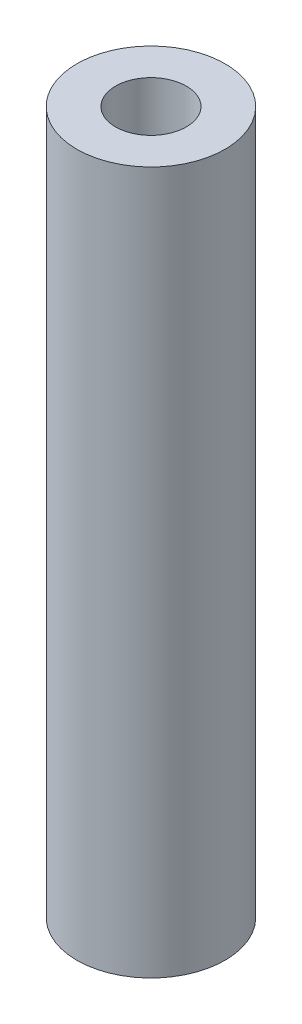
ISO-10303-21;
HEADER;
FILE_DESCRIPTION(('STEP AP214'),'2;1');
FILE_NAME('part.step','',(''),(''),'','','');
FILE_SCHEMA(('AUTOMOTIVE_DESIGN { 1 0 10303 214 1 1 1 1 }'));
ENDSEC;
DATA;
#1=APPLICATION_CONTEXT('core data for automotive mechanical design processes');
#2=APPLICATION_PROTOCOL_DEFINITION('international standard','automotive_design',2000,#1);
#3=PRODUCT_CONTEXT('',#1,'mechanical');
#4=PRODUCT('Part','Part','',(#3));
#5=PRODUCT_RELATED_PRODUCT_CATEGORY('part','',(#4));
#6=PRODUCT_DEFINITION_FORMATION('','',#4);
#7=PRODUCT_DEFINITION_CONTEXT('part definition',#1,'design');
#8=PRODUCT_DEFINITION('design','',#6,#7);
#9=PRODUCT_DEFINITION_SHAPE('','',#8);
#10=(LENGTH_UNIT() NAMED_UNIT(*) SI_UNIT(.MILLI.,.METRE.));
#11=(NAMED_UNIT(*) PLANE_ANGLE_UNIT() SI_UNIT($,.RADIAN.));
#12=(NAMED_UNIT(*) SI_UNIT($,.STERADIAN.) SOLID_ANGLE_UNIT());
#13=UNCERTAINTY_MEASURE_WITH_UNIT(LENGTH_MEASURE(1.E-05),#10,'distance_accuracy_value','');
#14=(GEOMETRIC_REPRESENTATION_CONTEXT(3) GLOBAL_UNCERTAINTY_ASSIGNED_CONTEXT((#13)) GLOBAL_UNIT_ASSIGNED_CONTEXT((#10,
#11,#12)) REPRESENTATION_CONTEXT('',''));
#15=CARTESIAN_POINT('',(0.,0.,0.));
#16=DIRECTION('',(0.,0.,1.));
#17=DIRECTION('',(1.,0.,0.));
#18=AXIS2_PLACEMENT_3D('',#15,#16,#17);
#19=CARTESIAN_POINT('',(0.,21.325,0.));
#20=DIRECTION('',(0.,1.,0.));
#21=DIRECTION('',(0.,0.,1.));
#22=AXIS2_PLACEMENT_3D('',#19,#20,#21);
#23=PLANE('',#22);
#24=CARTESIAN_POINT('',(0.,21.325,0.));
#25=DIRECTION('',(0.,1.,0.));
#26=DIRECTION('',(0.,0.,1.));
#27=AXIS2_PLACEMENT_3D('',#24,#25,#26);
#28=CIRCLE('',#27,4.5);
#29=CARTESIAN_POINT('',(0.,21.325,4.5));
#30=VERTEX_POINT('',#29);
#31=EDGE_CURVE('E10',#30,#30,#28,.T.);
#32=ORIENTED_EDGE('',*,*,#31,.T.);
#33=EDGE_LOOP('',(#32));
#34=FACE_BOUND('',#33,.T.);
#35=CARTESIAN_POINT('',(0.,21.325,0.));
#36=DIRECTION('',(0.,1.,0.));
#37=DIRECTION('',(0.,0.,1.));
#38=AXIS2_PLACEMENT_3D('',#35,#36,#37);
#39=CIRCLE('',#38,2.15);
#40=CARTESIAN_POINT('',(0.,21.325,2.15));
#41=VERTEX_POINT('',#40);
#42=EDGE_CURVE('E50',#41,#41,#39,.T.);
#43=ORIENTED_EDGE('',*,*,#42,.F.);
#44=EDGE_LOOP('',(#43));
#45=FACE_BOUND('',#44,.T.);
#46=ADVANCED_FACE('F37',(#34,#45),#23,.T.);
#47=CARTESIAN_POINT('',(0.,-21.325,0.));
#48=DIRECTION('',(0.,1.,0.));
#49=DIRECTION('',(0.,0.,1.));
#50=AXIS2_PLACEMENT_3D('',#47,#48,#49);
#51=PLANE('',#50);
#52=CARTESIAN_POINT('',(0.,-21.325,0.));
#53=DIRECTION('',(0.,1.,0.));
#54=DIRECTION('',(0.,0.,1.));
#55=AXIS2_PLACEMENT_3D('',#52,#53,#54);
#56=CIRCLE('',#55,4.5);
#57=CARTESIAN_POINT('',(0.,-21.325,4.5));
#58=VERTEX_POINT('',#57);
#59=EDGE_CURVE('E41',#58,#58,#56,.T.);
#60=ORIENTED_EDGE('',*,*,#59,.F.);
#61=EDGE_LOOP('',(#60));
#62=FACE_BOUND('',#61,.T.);
#63=CARTESIAN_POINT('',(0.,-21.325,0.));
#64=DIRECTION('',(0.,1.,0.));
#65=DIRECTION('',(0.,0.,1.));
#66=AXIS2_PLACEMENT_3D('',#63,#64,#65);
#67=CIRCLE('',#66,2.15);
#68=CARTESIAN_POINT('',(0.,-21.325,2.15));
#69=VERTEX_POINT('',#68);
#70=EDGE_CURVE('E52',#69,#69,#67,.T.);
#71=ORIENTED_EDGE('',*,*,#70,.T.);
#72=EDGE_LOOP('',(#71));
#73=FACE_BOUND('',#72,.T.);
#74=ADVANCED_FACE('F64',(#62,#73),#51,.F.);
#75=CARTESIAN_POINT('',(0.,21.325,0.));
#76=DIRECTION('',(0.,-1.,0.));
#77=DIRECTION('',(0.,0.,-1.));
#78=AXIS2_PLACEMENT_3D('',#75,#76,#77);
#79=CYLINDRICAL_SURFACE('',#78,4.5);
#80=ORIENTED_EDGE('',*,*,#31,.F.);
#81=EDGE_LOOP('',(#80));
#82=FACE_BOUND('',#81,.T.);
#83=ORIENTED_EDGE('',*,*,#59,.T.);
#84=EDGE_LOOP('',(#83));
#85=FACE_BOUND('',#84,.T.);
#86=ADVANCED_FACE('F39',(#82,#85),#79,.T.);
#87=CARTESIAN_POINT('',(0.,21.325,0.));
#88=DIRECTION('',(0.,-1.,0.));
#89=DIRECTION('',(0.,0.,-1.));
#90=AXIS2_PLACEMENT_3D('',#87,#88,#89);
#91=CYLINDRICAL_SURFACE('',#90,2.15);
#92=ORIENTED_EDGE('',*,*,#42,.T.);
#93=EDGE_LOOP('',(#92));
#94=FACE_BOUND('',#93,.T.);
#95=ORIENTED_EDGE('',*,*,#70,.F.);
#96=EDGE_LOOP('',(#95));
#97=FACE_BOUND('',#96,.T.);
#98=ADVANCED_FACE('F60',(#94,#97),#91,.F.);
#99=CLOSED_SHELL('',(#46,#74,#86,#98));
#100=MANIFOLD_SOLID_BREP('B2',#99);
#101=ADVANCED_BREP_SHAPE_REPRESENTATION('',(#18,#100),#14);
#102=SHAPE_DEFINITION_REPRESENTATION(#9,#101);
ENDSEC;
END-ISO-10303-21;
